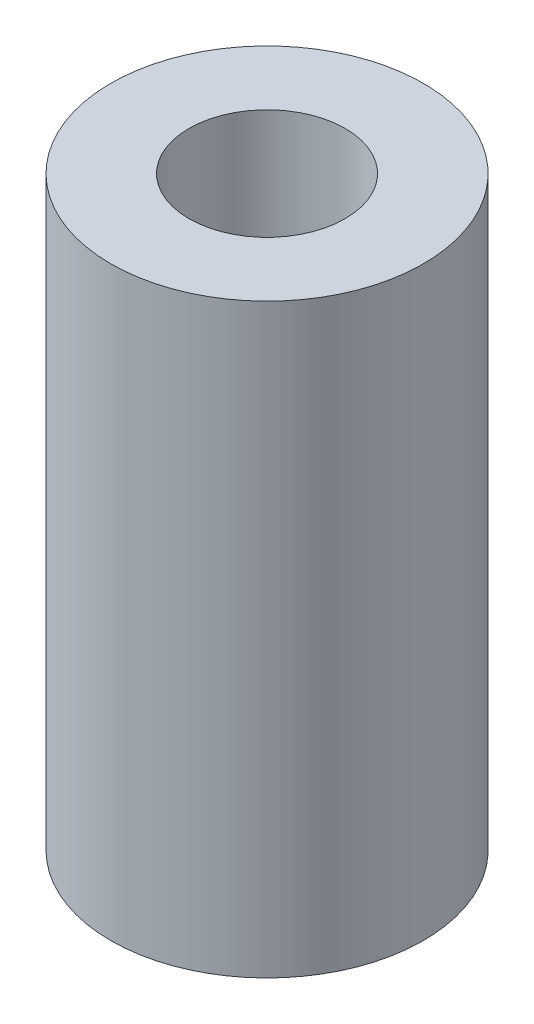
ISO-10303-21;
HEADER;
FILE_DESCRIPTION(('STEP AP214'),'2;1');
FILE_NAME('part.step','',(''),(''),'','','');
FILE_SCHEMA(('AUTOMOTIVE_DESIGN { 1 0 10303 214 1 1 1 1 }'));
ENDSEC;
DATA;
#1=APPLICATION_CONTEXT('core data for automotive mechanical design processes');
#2=APPLICATION_PROTOCOL_DEFINITION('international standard','automotive_design',2000,#1);
#3=PRODUCT_CONTEXT('',#1,'mechanical');
#4=PRODUCT('Part','Part','',(#3));
#5=PRODUCT_RELATED_PRODUCT_CATEGORY('part','',(#4));
#6=PRODUCT_DEFINITION_FORMATION('','',#4);
#7=PRODUCT_DEFINITION_CONTEXT('part definition',#1,'design');
#8=PRODUCT_DEFINITION('design','',#6,#7);
#9=PRODUCT_DEFINITION_SHAPE('','',#8);
#10=(LENGTH_UNIT() NAMED_UNIT(*) SI_UNIT(.MILLI.,.METRE.));
#11=(NAMED_UNIT(*) PLANE_ANGLE_UNIT() SI_UNIT($,.RADIAN.));
#12=(NAMED_UNIT(*) SI_UNIT($,.STERADIAN.) SOLID_ANGLE_UNIT());
#13=UNCERTAINTY_MEASURE_WITH_UNIT(LENGTH_MEASURE(1.E-05),#10,'distance_accuracy_value','');
#14=(GEOMETRIC_REPRESENTATION_CONTEXT(3) GLOBAL_UNCERTAINTY_ASSIGNED_CONTEXT((#13)) GLOBAL_UNIT_ASSIGNED_CONTEXT((#10,
#11,#12)) REPRESENTATION_CONTEXT('',''));
#15=CARTESIAN_POINT('',(0.,0.,0.));
#16=DIRECTION('',(0.,0.,1.));
#17=DIRECTION('',(1.,0.,0.));
#18=AXIS2_PLACEMENT_3D('',#15,#16,#17);
#19=CARTESIAN_POINT('',(0.,23.8125,0.));
#20=DIRECTION('',(0.,-1.,0.));
#21=DIRECTION('',(0.,0.,-1.));
#22=AXIS2_PLACEMENT_3D('',#19,#20,#21);
#23=CYLINDRICAL_SURFACE('',#22,6.35);
#24=CARTESIAN_POINT('',(0.,23.8125,0.));
#25=DIRECTION('',(0.,1.,0.));
#26=DIRECTION('',(0.,0.,1.));
#27=AXIS2_PLACEMENT_3D('',#24,#25,#26);
#28=CIRCLE('',#27,6.35);
#29=CARTESIAN_POINT('',(0.,23.8125,6.35));
#30=VERTEX_POINT('',#29);
#31=EDGE_CURVE('E10',#30,#30,#28,.T.);
#32=ORIENTED_EDGE('',*,*,#31,.F.);
#33=EDGE_LOOP('',(#32));
#34=FACE_BOUND('',#33,.T.);
#35=CARTESIAN_POINT('',(0.,0.,0.));
#36=DIRECTION('',(0.,1.,0.));
#37=DIRECTION('',(0.,0.,1.));
#38=AXIS2_PLACEMENT_3D('',#35,#36,#37);
#39=CIRCLE('',#38,6.35);
#40=CARTESIAN_POINT('',(0.,0.,6.35));
#41=VERTEX_POINT('',#40);
#42=EDGE_CURVE('E35',#41,#41,#39,.T.);
#43=ORIENTED_EDGE('',*,*,#42,.T.);
#44=EDGE_LOOP('',(#43));
#45=FACE_BOUND('',#44,.T.);
#46=ADVANCED_FACE('F32',(#34,#45),#23,.T.);
#47=CARTESIAN_POINT('',(0.,23.8125,0.));
#48=DIRECTION('',(0.,1.,0.));
#49=DIRECTION('',(0.,0.,1.));
#50=AXIS2_PLACEMENT_3D('',#47,#48,#49);
#51=PLANE('',#50);
#52=CARTESIAN_POINT('',(0.,23.8125,0.));
#53=DIRECTION('',(0.,1.,0.));
#54=DIRECTION('',(0.,0.,1.));
#55=AXIS2_PLACEMENT_3D('',#52,#53,#54);
#56=CIRCLE('',#55,3.175);
#57=CARTESIAN_POINT('',(0.,23.8125,3.175));
#58=VERTEX_POINT('',#57);
#59=EDGE_CURVE('E42',#58,#58,#56,.T.);
#60=ORIENTED_EDGE('',*,*,#59,.F.);
#61=EDGE_LOOP('',(#60));
#62=FACE_BOUND('',#61,.T.);
#63=ORIENTED_EDGE('',*,*,#31,.T.);
#64=EDGE_LOOP('',(#63));
#65=FACE_BOUND('',#64,.T.);
#66=ADVANCED_FACE('F60',(#62,#65),#51,.T.);
#67=CARTESIAN_POINT('',(0.,0.,0.));
#68=DIRECTION('',(0.,1.,0.));
#69=DIRECTION('',(0.,0.,1.));
#70=AXIS2_PLACEMENT_3D('',#67,#68,#69);
#71=PLANE('',#70);
#72=CARTESIAN_POINT('',(0.,0.,0.));
#73=DIRECTION('',(0.,1.,0.));
#74=DIRECTION('',(0.,0.,1.));
#75=AXIS2_PLACEMENT_3D('',#72,#73,#74);
#76=CIRCLE('',#75,3.175);
#77=CARTESIAN_POINT('',(0.,0.,3.175));
#78=VERTEX_POINT('',#77);
#79=EDGE_CURVE('E46',#78,#78,#76,.T.);
#80=ORIENTED_EDGE('',*,*,#79,.T.);
#81=EDGE_LOOP('',(#80));
#82=FACE_BOUND('',#81,.T.);
#83=ORIENTED_EDGE('',*,*,#42,.F.);
#84=EDGE_LOOP('',(#83));
#85=FACE_BOUND('',#84,.T.);
#86=ADVANCED_FACE('F50',(#82,#85),#71,.F.);
#87=CARTESIAN_POINT('',(0.,0.,0.));
#88=DIRECTION('',(0.,1.,0.));
#89=DIRECTION('',(0.,0.,1.));
#90=AXIS2_PLACEMENT_3D('',#87,#88,#89);
#91=CYLINDRICAL_SURFACE('',#90,3.175);
#92=ORIENTED_EDGE('',*,*,#59,.T.);
#93=EDGE_LOOP('',(#92));
#94=FACE_BOUND('',#93,.T.);
#95=ORIENTED_EDGE('',*,*,#79,.F.);
#96=EDGE_LOOP('',(#95));
#97=FACE_BOUND('',#96,.T.);
#98=ADVANCED_FACE('F53',(#94,#97),#91,.F.);
#99=CLOSED_SHELL('',(#46,#66,#86,#98));
#100=MANIFOLD_SOLID_BREP('B2',#99);
#101=ADVANCED_BREP_SHAPE_REPRESENTATION('',(#18,#100),#14);
#102=SHAPE_DEFINITION_REPRESENTATION(#9,#101);
ENDSEC;
END-ISO-10303-21;
